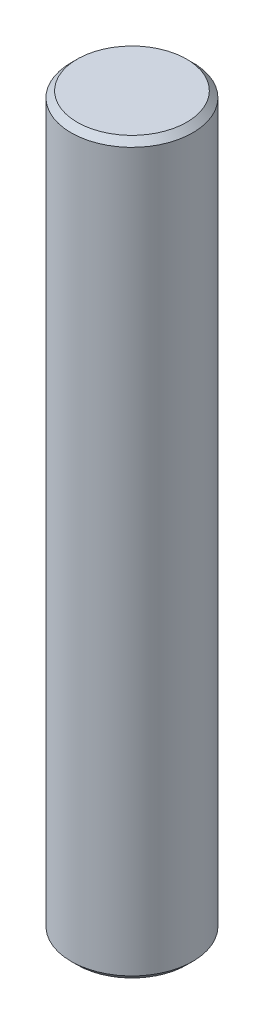
ISO-10303-21;
HEADER;
FILE_DESCRIPTION(('STEP AP214'),'2;1');
FILE_NAME('part.step','',(''),(''),'','','');
FILE_SCHEMA(('AUTOMOTIVE_DESIGN { 1 0 10303 214 1 1 1 1 }'));
ENDSEC;
DATA;
#1=APPLICATION_CONTEXT('core data for automotive mechanical design processes');
#2=APPLICATION_PROTOCOL_DEFINITION('international standard','automotive_design',2000,#1);
#3=PRODUCT_CONTEXT('',#1,'mechanical');
#4=PRODUCT('Part','Part','',(#3));
#5=PRODUCT_RELATED_PRODUCT_CATEGORY('part','',(#4));
#6=PRODUCT_DEFINITION_FORMATION('','',#4);
#7=PRODUCT_DEFINITION_CONTEXT('part definition',#1,'design');
#8=PRODUCT_DEFINITION('design','',#6,#7);
#9=PRODUCT_DEFINITION_SHAPE('','',#8);
#10=(LENGTH_UNIT() NAMED_UNIT(*) SI_UNIT(.MILLI.,.METRE.));
#11=(NAMED_UNIT(*) PLANE_ANGLE_UNIT() SI_UNIT($,.RADIAN.));
#12=(NAMED_UNIT(*) SI_UNIT($,.STERADIAN.) SOLID_ANGLE_UNIT());
#13=UNCERTAINTY_MEASURE_WITH_UNIT(LENGTH_MEASURE(1.E-05),#10,'distance_accuracy_value','');
#14=(GEOMETRIC_REPRESENTATION_CONTEXT(3) GLOBAL_UNCERTAINTY_ASSIGNED_CONTEXT((#13)) GLOBAL_UNIT_ASSIGNED_CONTEXT((#10,
#11,#12)) REPRESENTATION_CONTEXT('',''));
#15=CARTESIAN_POINT('',(0.,0.,0.));
#16=DIRECTION('',(0.,0.,1.));
#17=DIRECTION('',(1.,0.,0.));
#18=AXIS2_PLACEMENT_3D('',#15,#16,#17);
#19=CARTESIAN_POINT('',(0.,15.,0.));
#20=DIRECTION('',(0.,-1.,0.));
#21=DIRECTION('',(0.,0.,-1.));
#22=AXIS2_PLACEMENT_3D('',#19,#20,#21);
#23=CYLINDRICAL_SURFACE('',#22,2.5);
#24=CARTESIAN_POINT('',(0.,-14.75,0.));
#25=DIRECTION('',(0.,1.,0.));
#26=DIRECTION('',(0.,0.,1.));
#27=AXIS2_PLACEMENT_3D('',#24,#25,#26);
#28=CIRCLE('',#27,2.5);
#29=CARTESIAN_POINT('',(0.,-14.75,2.5));
#30=VERTEX_POINT('',#29);
#31=EDGE_CURVE('E49',#30,#30,#28,.T.);
#32=ORIENTED_EDGE('',*,*,#31,.T.);
#33=EDGE_LOOP('',(#32));
#34=FACE_BOUND('',#33,.T.);
#35=CARTESIAN_POINT('',(0.,14.75,0.));
#36=DIRECTION('',(0.,1.,0.));
#37=DIRECTION('',(0.,0.,1.));
#38=AXIS2_PLACEMENT_3D('',#35,#36,#37);
#39=CIRCLE('',#38,2.5);
#40=CARTESIAN_POINT('',(0.,14.75,2.5));
#41=VERTEX_POINT('',#40);
#42=EDGE_CURVE('E53',#41,#41,#39,.F.);
#43=ORIENTED_EDGE('',*,*,#42,.T.);
#44=EDGE_LOOP('',(#43));
#45=FACE_BOUND('',#44,.T.);
#46=ADVANCED_FACE('F37',(#34,#45),#23,.T.);
#47=CARTESIAN_POINT('',(0.,15.,0.));
#48=DIRECTION('',(0.,1.,0.));
#49=DIRECTION('',(0.,0.,1.));
#50=AXIS2_PLACEMENT_3D('',#47,#48,#49);
#51=PLANE('',#50);
#52=CARTESIAN_POINT('',(0.,15.,0.));
#53=DIRECTION('',(0.,1.,0.));
#54=DIRECTION('',(0.,0.,1.));
#55=AXIS2_PLACEMENT_3D('',#52,#53,#54);
#56=CIRCLE('',#55,2.25);
#57=CARTESIAN_POINT('',(0.,15.,2.25));
#58=VERTEX_POINT('',#57);
#59=EDGE_CURVE('E10',#58,#58,#56,.T.);
#60=ORIENTED_EDGE('',*,*,#59,.T.);
#61=EDGE_LOOP('',(#60));
#62=FACE_BOUND('',#61,.T.);
#63=ADVANCED_FACE('F69',(#62),#51,.T.);
#64=CARTESIAN_POINT('',(0.,-15.,0.));
#65=DIRECTION('',(0.,1.,0.));
#66=DIRECTION('',(0.,0.,1.));
#67=AXIS2_PLACEMENT_3D('',#64,#65,#66);
#68=PLANE('',#67);
#69=CARTESIAN_POINT('',(0.,-15.,0.));
#70=DIRECTION('',(0.,1.,0.));
#71=DIRECTION('',(0.,0.,1.));
#72=AXIS2_PLACEMENT_3D('',#69,#70,#71);
#73=CIRCLE('',#72,2.25);
#74=CARTESIAN_POINT('',(0.,-15.,2.25));
#75=VERTEX_POINT('',#74);
#76=EDGE_CURVE('E45',#75,#75,#73,.F.);
#77=ORIENTED_EDGE('',*,*,#76,.T.);
#78=EDGE_LOOP('',(#77));
#79=FACE_BOUND('',#78,.T.);
#80=ADVANCED_FACE('F66',(#79),#68,.F.);
#81=CARTESIAN_POINT('',(0.,-14.75,0.));
#82=DIRECTION('',(0.,1.,0.));
#83=DIRECTION('',(0.,0.,1.));
#84=AXIS2_PLACEMENT_3D('',#81,#82,#83);
#85=CONICAL_SURFACE('',#84,2.5,0.785398163397458);
#86=ORIENTED_EDGE('',*,*,#76,.F.);
#87=EDGE_LOOP('',(#86));
#88=FACE_BOUND('',#87,.T.);
#89=ORIENTED_EDGE('',*,*,#31,.F.);
#90=EDGE_LOOP('',(#89));
#91=FACE_BOUND('',#90,.T.);
#92=ADVANCED_FACE('F62',(#88,#91),#85,.T.);
#93=CARTESIAN_POINT('',(0.,15.,0.));
#94=DIRECTION('',(0.,-1.,0.));
#95=DIRECTION('',(0.,0.,-1.));
#96=AXIS2_PLACEMENT_3D('',#93,#94,#95);
#97=CONICAL_SURFACE('',#96,2.25,0.785398163397451);
#98=ORIENTED_EDGE('',*,*,#42,.F.);
#99=EDGE_LOOP('',(#98));
#100=FACE_BOUND('',#99,.T.);
#101=ORIENTED_EDGE('',*,*,#59,.F.);
#102=EDGE_LOOP('',(#101));
#103=FACE_BOUND('',#102,.T.);
#104=ADVANCED_FACE('F40',(#100,#103),#97,.T.);
#105=CLOSED_SHELL('',(#46,#63,#80,#92,#104));
#106=MANIFOLD_SOLID_BREP('B2',#105);
#107=ADVANCED_BREP_SHAPE_REPRESENTATION('',(#18,#106),#14);
#108=SHAPE_DEFINITION_REPRESENTATION(#9,#107);
ENDSEC;
END-ISO-10303-21;
